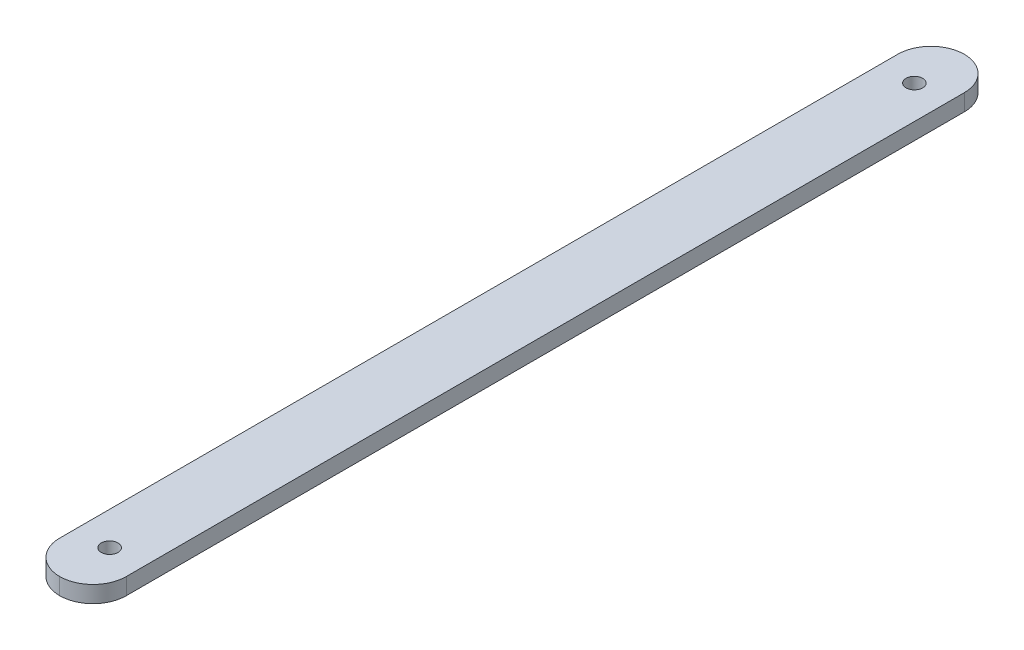
ISO-10303-21;
HEADER;
FILE_DESCRIPTION(('STEP AP214'),'2;1');
FILE_NAME('part.step','',(''),(''),'','','');
FILE_SCHEMA(('AUTOMOTIVE_DESIGN { 1 0 10303 214 1 1 1 1 }'));
ENDSEC;
DATA;
#1=APPLICATION_CONTEXT('core data for automotive mechanical design processes');
#2=APPLICATION_PROTOCOL_DEFINITION('international standard','automotive_design',2000,#1);
#3=PRODUCT_CONTEXT('',#1,'mechanical');
#4=PRODUCT('Part','Part','',(#3));
#5=PRODUCT_RELATED_PRODUCT_CATEGORY('part','',(#4));
#6=PRODUCT_DEFINITION_FORMATION('','',#4);
#7=PRODUCT_DEFINITION_CONTEXT('part definition',#1,'design');
#8=PRODUCT_DEFINITION('design','',#6,#7);
#9=PRODUCT_DEFINITION_SHAPE('','',#8);
#10=(LENGTH_UNIT() NAMED_UNIT(*) SI_UNIT(.MILLI.,.METRE.));
#11=(NAMED_UNIT(*) PLANE_ANGLE_UNIT() SI_UNIT($,.RADIAN.));
#12=(NAMED_UNIT(*) SI_UNIT($,.STERADIAN.) SOLID_ANGLE_UNIT());
#13=UNCERTAINTY_MEASURE_WITH_UNIT(LENGTH_MEASURE(1.E-05),#10,'distance_accuracy_value','');
#14=(GEOMETRIC_REPRESENTATION_CONTEXT(3) GLOBAL_UNCERTAINTY_ASSIGNED_CONTEXT((#13)) GLOBAL_UNIT_ASSIGNED_CONTEXT((#10,
#11,#12)) REPRESENTATION_CONTEXT('',''));
#15=CARTESIAN_POINT('',(0.,0.,0.));
#16=DIRECTION('',(0.,0.,1.));
#17=DIRECTION('',(1.,0.,0.));
#18=AXIS2_PLACEMENT_3D('',#15,#16,#17);
#19=CARTESIAN_POINT('',(-2.29354531307294,4.9030445235995,271.75));
#20=DIRECTION('',(1.,0.,0.));
#21=DIRECTION('',(0.,1.,0.));
#22=AXIS2_PLACEMENT_3D('',#19,#20,#21);
#23=PLANE('',#22);
#24=DIRECTION('',(0.,0.,-1.));
#25=VECTOR('',#24,1.);
#26=CARTESIAN_POINT('',(-2.29354531307294,4.9030445235995,271.75));
#27=LINE('',#26,#25);
#28=CARTESIAN_POINT('',(-2.29354531307294,4.9030445235995,261.75));
#29=VERTEX_POINT('',#28);
#30=CARTESIAN_POINT('',(-2.29354531307294,4.9030445235995,10.));
#31=VERTEX_POINT('',#30);
#32=EDGE_CURVE('E170',#29,#31,#27,.T.);
#33=ORIENTED_EDGE('',*,*,#32,.T.);
#34=DIRECTION('',(0.,-1.,0.));
#35=VECTOR('',#34,1.);
#36=CARTESIAN_POINT('',(-2.29354531307294,-0.0969554764005025,10.));
#37=LINE('',#36,#35);
#38=CARTESIAN_POINT('',(-2.29354531307294,-0.0969554764005025,10.));
#39=VERTEX_POINT('',#38);
#40=EDGE_CURVE('E119',#31,#39,#37,.T.);
#41=ORIENTED_EDGE('',*,*,#40,.T.);
#42=DIRECTION('',(0.,0.,-1.));
#43=VECTOR('',#42,1.);
#44=CARTESIAN_POINT('',(-2.29354531307294,-0.0969554764005025,271.75));
#45=LINE('',#44,#43);
#46=CARTESIAN_POINT('',(-2.29354531307294,-0.0969554764005025,261.75));
#47=VERTEX_POINT('',#46);
#48=EDGE_CURVE('E101',#47,#39,#45,.T.);
#49=ORIENTED_EDGE('',*,*,#48,.F.);
#50=DIRECTION('',(0.,-1.,0.));
#51=VECTOR('',#50,1.);
#52=CARTESIAN_POINT('',(-2.29354531307294,4.9030445235995,261.75));
#53=LINE('',#52,#51);
#54=EDGE_CURVE('E116',#47,#29,#53,.F.);
#55=ORIENTED_EDGE('',*,*,#54,.T.);
#56=EDGE_LOOP('',(#33,#41,#49,#55));
#57=FACE_BOUND('',#56,.T.);
#58=ADVANCED_FACE('F43',(#57),#23,.F.);
#59=CARTESIAN_POINT('',(17.7064546869271,-0.0969554764005,271.75));
#60=DIRECTION('',(0.,1.,0.));
#61=DIRECTION('',(-1.,0.,0.));
#62=AXIS2_PLACEMENT_3D('',#59,#60,#61);
#63=PLANE('',#62);
#64=CARTESIAN_POINT('',(7.70645468692706,-0.0969554764005121,15.));
#65=DIRECTION('',(0.,1.,0.));
#66=DIRECTION('',(-1.,0.,0.));
#67=AXIS2_PLACEMENT_3D('',#64,#65,#66);
#68=CIRCLE('',#67,2.5);
#69=CARTESIAN_POINT('',(5.20645468692706,-0.0969554764005124,15.));
#70=VERTEX_POINT('',#69);
#71=EDGE_CURVE('E175',#70,#70,#68,.T.);
#72=ORIENTED_EDGE('',*,*,#71,.T.);
#73=EDGE_LOOP('',(#72));
#74=FACE_BOUND('',#73,.T.);
#75=CARTESIAN_POINT('',(7.70645468692706,-0.0969554764005121,256.75));
#76=DIRECTION('',(0.,1.,0.));
#77=DIRECTION('',(-1.,0.,0.));
#78=AXIS2_PLACEMENT_3D('',#75,#76,#77);
#79=CIRCLE('',#78,2.5);
#80=CARTESIAN_POINT('',(5.20645468692706,-0.0969554764005124,256.75));
#81=VERTEX_POINT('',#80);
#82=EDGE_CURVE('E161',#81,#81,#79,.T.);
#83=ORIENTED_EDGE('',*,*,#82,.T.);
#84=EDGE_LOOP('',(#83));
#85=FACE_BOUND('',#84,.T.);
#86=ORIENTED_EDGE('',*,*,#48,.T.);
#87=CARTESIAN_POINT('',(7.70645468692706,-0.0969554764005008,10.));
#88=DIRECTION('',(0.,1.,0.));
#89=DIRECTION('',(-1.,0.,0.));
#90=AXIS2_PLACEMENT_3D('',#87,#88,#89);
#91=CIRCLE('',#90,10.);
#92=CARTESIAN_POINT('',(7.70645468692706,-0.0969554764005013,0.));
#93=VERTEX_POINT('',#92);
#94=EDGE_CURVE('E137',#39,#93,#91,.F.);
#95=ORIENTED_EDGE('',*,*,#94,.T.);
#96=CARTESIAN_POINT('',(7.70645468692706,-0.0969554764005008,10.));
#97=DIRECTION('',(0.,1.,0.));
#98=DIRECTION('',(-1.,0.,0.));
#99=AXIS2_PLACEMENT_3D('',#96,#97,#98);
#100=CIRCLE('',#99,10.);
#101=CARTESIAN_POINT('',(17.7064546869271,-0.0969554764005,10.));
#102=VERTEX_POINT('',#101);
#103=EDGE_CURVE('E110',#93,#102,#100,.F.);
#104=ORIENTED_EDGE('',*,*,#103,.T.);
#105=DIRECTION('',(0.,0.,-1.));
#106=VECTOR('',#105,1.);
#107=CARTESIAN_POINT('',(17.7064546869271,-0.0969554764005,271.75));
#108=LINE('',#107,#106);
#109=CARTESIAN_POINT('',(17.7064546869271,-0.0969554764005,261.75));
#110=VERTEX_POINT('',#109);
#111=EDGE_CURVE('E121',#110,#102,#108,.T.);
#112=ORIENTED_EDGE('',*,*,#111,.F.);
#113=CARTESIAN_POINT('',(7.70645468692706,-0.0969554764005013,261.75));
#114=DIRECTION('',(0.,1.,0.));
#115=DIRECTION('',(-1.,0.,0.));
#116=AXIS2_PLACEMENT_3D('',#113,#114,#115);
#117=CIRCLE('',#116,10.);
#118=CARTESIAN_POINT('',(7.70645468692706,-0.0969554764005013,271.75));
#119=VERTEX_POINT('',#118);
#120=EDGE_CURVE('E104',#110,#119,#117,.F.);
#121=ORIENTED_EDGE('',*,*,#120,.T.);
#122=CARTESIAN_POINT('',(7.70645468692706,-0.0969554764005013,261.75));
#123=DIRECTION('',(0.,1.,0.));
#124=DIRECTION('',(-1.,0.,0.));
#125=AXIS2_PLACEMENT_3D('',#122,#123,#124);
#126=CIRCLE('',#125,10.);
#127=EDGE_CURVE('E98',#119,#47,#126,.F.);
#128=ORIENTED_EDGE('',*,*,#127,.T.);
#129=EDGE_LOOP('',(#86,#95,#104,#112,#121,#128));
#130=FACE_BOUND('',#129,.T.);
#131=ADVANCED_FACE('F100',(#74,#85,#130),#63,.F.);
#132=CARTESIAN_POINT('',(17.7064546869271,4.9030445235995,271.75));
#133=DIRECTION('',(-1.,0.,0.));
#134=DIRECTION('',(0.,0.,1.));
#135=AXIS2_PLACEMENT_3D('',#132,#133,#134);
#136=PLANE('',#135);
#137=ORIENTED_EDGE('',*,*,#111,.T.);
#138=DIRECTION('',(0.,1.,0.));
#139=VECTOR('',#138,1.);
#140=CARTESIAN_POINT('',(17.7064546869271,4.9030445235995,10.));
#141=LINE('',#140,#139);
#142=CARTESIAN_POINT('',(17.7064546869271,4.9030445235995,10.));
#143=VERTEX_POINT('',#142);
#144=EDGE_CURVE('E11',#102,#143,#141,.T.);
#145=ORIENTED_EDGE('',*,*,#144,.T.);
#146=DIRECTION('',(0.,0.,-1.));
#147=VECTOR('',#146,1.);
#148=CARTESIAN_POINT('',(17.7064546869271,4.9030445235995,271.75));
#149=LINE('',#148,#147);
#150=CARTESIAN_POINT('',(17.7064546869271,4.9030445235995,261.75));
#151=VERTEX_POINT('',#150);
#152=EDGE_CURVE('E165',#151,#143,#149,.T.);
#153=ORIENTED_EDGE('',*,*,#152,.F.);
#154=DIRECTION('',(0.,1.,0.));
#155=VECTOR('',#154,1.);
#156=CARTESIAN_POINT('',(17.7064546869271,4.9030445235995,261.75));
#157=LINE('',#156,#155);
#158=EDGE_CURVE('E53',#151,#110,#157,.F.);
#159=ORIENTED_EDGE('',*,*,#158,.T.);
#160=EDGE_LOOP('',(#137,#145,#153,#159));
#161=FACE_BOUND('',#160,.T.);
#162=ADVANCED_FACE('F164',(#161),#136,.F.);
#163=CARTESIAN_POINT('',(17.7064546869271,4.9030445235995,271.75));
#164=DIRECTION('',(0.,-1.,0.));
#165=DIRECTION('',(1.,0.,0.));
#166=AXIS2_PLACEMENT_3D('',#163,#164,#165);
#167=PLANE('',#166);
#168=CARTESIAN_POINT('',(7.70645468692706,4.90304452359949,15.));
#169=DIRECTION('',(0.,-1.,0.));
#170=DIRECTION('',(1.,0.,0.));
#171=AXIS2_PLACEMENT_3D('',#168,#169,#170);
#172=CIRCLE('',#171,2.5);
#173=CARTESIAN_POINT('',(10.2064546869271,4.90304452359949,15.));
#174=VERTEX_POINT('',#173);
#175=EDGE_CURVE('E130',#174,#174,#172,.T.);
#176=ORIENTED_EDGE('',*,*,#175,.T.);
#177=EDGE_LOOP('',(#176));
#178=FACE_BOUND('',#177,.T.);
#179=CARTESIAN_POINT('',(7.70645468692706,4.90304452359949,256.75));
#180=DIRECTION('',(0.,-1.,0.));
#181=DIRECTION('',(1.,0.,0.));
#182=AXIS2_PLACEMENT_3D('',#179,#180,#181);
#183=CIRCLE('',#182,2.5);
#184=CARTESIAN_POINT('',(10.2064546869271,4.90304452359949,256.75));
#185=VERTEX_POINT('',#184);
#186=EDGE_CURVE('E154',#185,#185,#183,.T.);
#187=ORIENTED_EDGE('',*,*,#186,.T.);
#188=EDGE_LOOP('',(#187));
#189=FACE_BOUND('',#188,.T.);
#190=CARTESIAN_POINT('',(7.70645468692706,4.9030445235995,10.));
#191=DIRECTION('',(0.,-1.,0.));
#192=DIRECTION('',(1.,0.,0.));
#193=AXIS2_PLACEMENT_3D('',#190,#191,#192);
#194=CIRCLE('',#193,10.);
#195=CARTESIAN_POINT('',(7.70645468692706,4.9030445235995,0.));
#196=VERTEX_POINT('',#195);
#197=EDGE_CURVE('E144',#143,#196,#194,.F.);
#198=ORIENTED_EDGE('',*,*,#197,.T.);
#199=CARTESIAN_POINT('',(7.70645468692706,4.9030445235995,10.));
#200=DIRECTION('',(0.,-1.,0.));
#201=DIRECTION('',(1.,0.,0.));
#202=AXIS2_PLACEMENT_3D('',#199,#200,#201);
#203=CIRCLE('',#202,10.);
#204=EDGE_CURVE('E147',#196,#31,#203,.F.);
#205=ORIENTED_EDGE('',*,*,#204,.T.);
#206=ORIENTED_EDGE('',*,*,#32,.F.);
#207=CARTESIAN_POINT('',(7.70645468692706,4.9030445235995,261.75));
#208=DIRECTION('',(0.,-1.,0.));
#209=DIRECTION('',(1.,0.,0.));
#210=AXIS2_PLACEMENT_3D('',#207,#208,#209);
#211=CIRCLE('',#210,10.);
#212=CARTESIAN_POINT('',(7.70645468692706,4.9030445235995,271.75));
#213=VERTEX_POINT('',#212);
#214=EDGE_CURVE('E124',#29,#213,#211,.F.);
#215=ORIENTED_EDGE('',*,*,#214,.T.);
#216=CARTESIAN_POINT('',(7.70645468692706,4.9030445235995,261.75));
#217=DIRECTION('',(0.,-1.,0.));
#218=DIRECTION('',(1.,0.,0.));
#219=AXIS2_PLACEMENT_3D('',#216,#217,#218);
#220=CIRCLE('',#219,10.);
#221=EDGE_CURVE('E66',#213,#151,#220,.F.);
#222=ORIENTED_EDGE('',*,*,#221,.T.);
#223=ORIENTED_EDGE('',*,*,#152,.T.);
#224=EDGE_LOOP('',(#198,#205,#206,#215,#222,#223));
#225=FACE_BOUND('',#224,.T.);
#226=ADVANCED_FACE('F187',(#178,#189,#225),#167,.F.);
#227=CARTESIAN_POINT('',(7.70645468692706,-125.875,256.75));
#228=DIRECTION('',(0.,1.,0.));
#229=DIRECTION('',(0.,0.,1.));
#230=AXIS2_PLACEMENT_3D('',#227,#228,#229);
#231=CYLINDRICAL_SURFACE('',#230,2.5);
#232=ORIENTED_EDGE('',*,*,#186,.F.);
#233=EDGE_LOOP('',(#232));
#234=FACE_BOUND('',#233,.T.);
#235=ORIENTED_EDGE('',*,*,#82,.F.);
#236=EDGE_LOOP('',(#235));
#237=FACE_BOUND('',#236,.T.);
#238=ADVANCED_FACE('F194',(#234,#237),#231,.F.);
#239=CARTESIAN_POINT('',(7.70645468692706,-125.875,15.));
#240=DIRECTION('',(0.,1.,0.));
#241=DIRECTION('',(0.,0.,1.));
#242=AXIS2_PLACEMENT_3D('',#239,#240,#241);
#243=CYLINDRICAL_SURFACE('',#242,2.5);
#244=ORIENTED_EDGE('',*,*,#175,.F.);
#245=EDGE_LOOP('',(#244));
#246=FACE_BOUND('',#245,.T.);
#247=ORIENTED_EDGE('',*,*,#71,.F.);
#248=EDGE_LOOP('',(#247));
#249=FACE_BOUND('',#248,.T.);
#250=ADVANCED_FACE('F190',(#246,#249),#243,.F.);
#251=CARTESIAN_POINT('',(7.70645468692706,4.9030445235995,10.));
#252=DIRECTION('',(0.,-1.,0.));
#253=DIRECTION('',(0.,0.,-1.));
#254=AXIS2_PLACEMENT_3D('',#251,#252,#253);
#255=CYLINDRICAL_SURFACE('',#254,10.);
#256=DIRECTION('',(0.,1.,0.));
#257=VECTOR('',#256,1.);
#258=CARTESIAN_POINT('',(7.70645468692706,-0.0969554764004999,0.));
#259=LINE('',#258,#257);
#260=EDGE_CURVE('E151',#196,#93,#259,.F.);
#261=ORIENTED_EDGE('',*,*,#260,.F.);
#262=ORIENTED_EDGE('',*,*,#197,.F.);
#263=ORIENTED_EDGE('',*,*,#144,.F.);
#264=ORIENTED_EDGE('',*,*,#103,.F.);
#265=EDGE_LOOP('',(#261,#262,#263,#264));
#266=FACE_BOUND('',#265,.T.);
#267=ADVANCED_FACE('F193',(#266),#255,.T.);
#268=CARTESIAN_POINT('',(7.70645468692706,4.9030445235995,10.));
#269=DIRECTION('',(0.,1.,0.));
#270=DIRECTION('',(-1.,0.,0.));
#271=AXIS2_PLACEMENT_3D('',#268,#269,#270);
#272=CYLINDRICAL_SURFACE('',#271,10.);
#273=ORIENTED_EDGE('',*,*,#204,.F.);
#274=ORIENTED_EDGE('',*,*,#260,.T.);
#275=ORIENTED_EDGE('',*,*,#94,.F.);
#276=ORIENTED_EDGE('',*,*,#40,.F.);
#277=EDGE_LOOP('',(#273,#274,#275,#276));
#278=FACE_BOUND('',#277,.T.);
#279=ADVANCED_FACE('F208',(#278),#272,.T.);
#280=CARTESIAN_POINT('',(7.70645468692706,0.,261.75));
#281=DIRECTION('',(0.,1.,0.));
#282=DIRECTION('',(0.,0.,1.));
#283=AXIS2_PLACEMENT_3D('',#280,#281,#282);
#284=CYLINDRICAL_SURFACE('',#283,10.);
#285=ORIENTED_EDGE('',*,*,#158,.F.);
#286=ORIENTED_EDGE('',*,*,#221,.F.);
#287=DIRECTION('',(0.,1.,0.));
#288=VECTOR('',#287,1.);
#289=CARTESIAN_POINT('',(7.70645468692706,0.,271.75));
#290=LINE('',#289,#288);
#291=EDGE_CURVE('E47',#119,#213,#290,.T.);
#292=ORIENTED_EDGE('',*,*,#291,.F.);
#293=ORIENTED_EDGE('',*,*,#120,.F.);
#294=EDGE_LOOP('',(#285,#286,#292,#293));
#295=FACE_BOUND('',#294,.T.);
#296=ADVANCED_FACE('F45',(#295),#284,.T.);
#297=CARTESIAN_POINT('',(7.70645468692706,0.,261.75));
#298=DIRECTION('',(0.,-1.,0.));
#299=DIRECTION('',(1.,0.,0.));
#300=AXIS2_PLACEMENT_3D('',#297,#298,#299);
#301=CYLINDRICAL_SURFACE('',#300,10.);
#302=ORIENTED_EDGE('',*,*,#214,.F.);
#303=ORIENTED_EDGE('',*,*,#54,.F.);
#304=ORIENTED_EDGE('',*,*,#127,.F.);
#305=ORIENTED_EDGE('',*,*,#291,.T.);
#306=EDGE_LOOP('',(#302,#303,#304,#305));
#307=FACE_BOUND('',#306,.T.);
#308=ADVANCED_FACE('F123',(#307),#301,.T.);
#309=CLOSED_SHELL('',(#58,#131,#162,#226,#238,#250,#267,#279,#296,#308));
#310=MANIFOLD_SOLID_BREP('B2',#309);
#311=ADVANCED_BREP_SHAPE_REPRESENTATION('',(#18,#310),#14);
#312=SHAPE_DEFINITION_REPRESENTATION(#9,#311);
ENDSEC;
END-ISO-10303-21;
